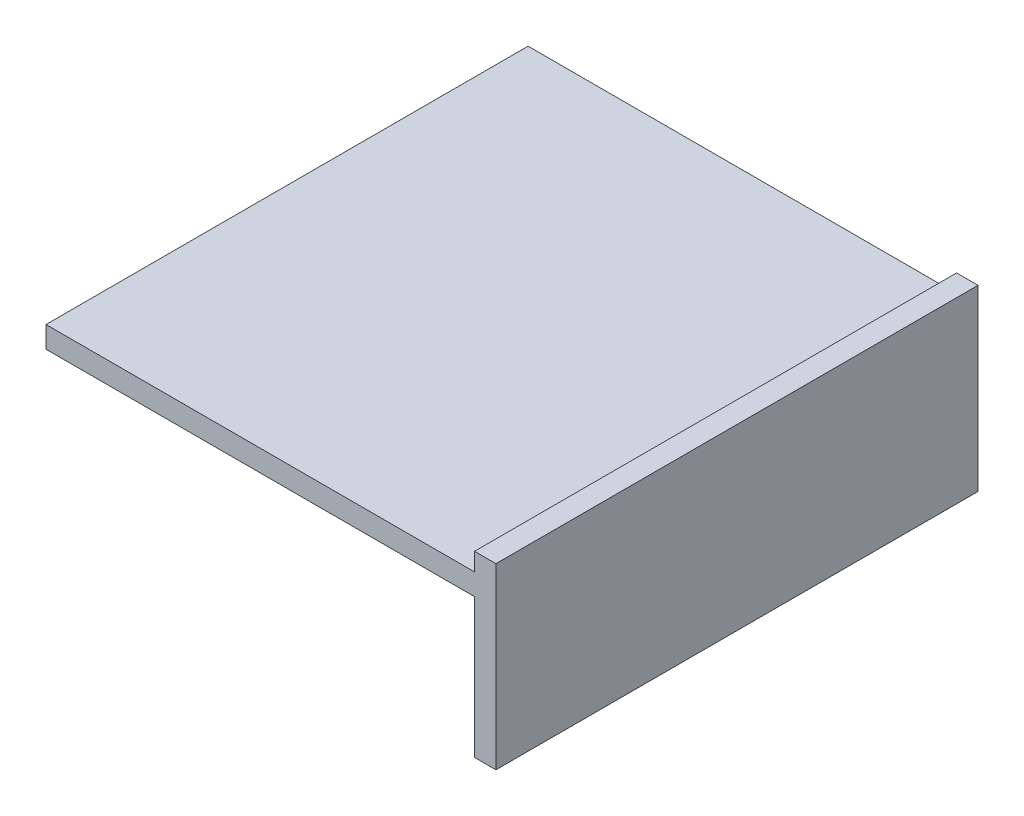
ISO-10303-21;
HEADER;
FILE_DESCRIPTION(('STEP AP214'),'2;1');
FILE_NAME('part.step','',(''),(''),'','','');
FILE_SCHEMA(('AUTOMOTIVE_DESIGN { 1 0 10303 214 1 1 1 1 }'));
ENDSEC;
DATA;
#1=APPLICATION_CONTEXT('core data for automotive mechanical design processes');
#2=APPLICATION_PROTOCOL_DEFINITION('international standard','automotive_design',2000,#1);
#3=PRODUCT_CONTEXT('',#1,'mechanical');
#4=PRODUCT('Part','Part','',(#3));
#5=PRODUCT_RELATED_PRODUCT_CATEGORY('part','',(#4));
#6=PRODUCT_DEFINITION_FORMATION('','',#4);
#7=PRODUCT_DEFINITION_CONTEXT('part definition',#1,'design');
#8=PRODUCT_DEFINITION('design','',#6,#7);
#9=PRODUCT_DEFINITION_SHAPE('','',#8);
#10=(LENGTH_UNIT() NAMED_UNIT(*) SI_UNIT(.MILLI.,.METRE.));
#11=(NAMED_UNIT(*) PLANE_ANGLE_UNIT() SI_UNIT($,.RADIAN.));
#12=(NAMED_UNIT(*) SI_UNIT($,.STERADIAN.) SOLID_ANGLE_UNIT());
#13=UNCERTAINTY_MEASURE_WITH_UNIT(LENGTH_MEASURE(1.E-05),#10,'distance_accuracy_value','');
#14=(GEOMETRIC_REPRESENTATION_CONTEXT(3) GLOBAL_UNCERTAINTY_ASSIGNED_CONTEXT((#13)) GLOBAL_UNIT_ASSIGNED_CONTEXT((#10,
#11,#12)) REPRESENTATION_CONTEXT('',''));
#15=CARTESIAN_POINT('',(0.,0.,0.));
#16=DIRECTION('',(0.,0.,1.));
#17=DIRECTION('',(1.,0.,0.));
#18=AXIS2_PLACEMENT_3D('',#15,#16,#17);
#19=CARTESIAN_POINT('',(0.,0.,0.));
#20=DIRECTION('',(0.,-1.,0.));
#21=DIRECTION('',(0.,0.,-1.));
#22=AXIS2_PLACEMENT_3D('',#19,#20,#21);
#23=PLANE('',#22);
#24=DIRECTION('',(0.,0.,1.));
#25=VECTOR('',#24,1.);
#26=CARTESIAN_POINT('',(0.,0.,0.));
#27=LINE('',#26,#25);
#28=CARTESIAN_POINT('',(0.,0.,-258.));
#29=VERTEX_POINT('',#28);
#30=CARTESIAN_POINT('',(0.,0.,0.));
#31=VERTEX_POINT('',#30);
#32=EDGE_CURVE('E72',#29,#31,#27,.T.);
#33=ORIENTED_EDGE('',*,*,#32,.F.);
#34=DIRECTION('',(1.,0.,0.));
#35=VECTOR('',#34,1.);
#36=CARTESIAN_POINT('',(0.,0.,-258.));
#37=LINE('',#36,#35);
#38=CARTESIAN_POINT('',(240.,0.,-258.));
#39=VERTEX_POINT('',#38);
#40=EDGE_CURVE('E140',#29,#39,#37,.T.);
#41=ORIENTED_EDGE('',*,*,#40,.T.);
#42=DIRECTION('',(0.,0.,-1.));
#43=VECTOR('',#42,1.);
#44=CARTESIAN_POINT('',(240.,0.,0.));
#45=LINE('',#44,#43);
#46=CARTESIAN_POINT('',(240.,0.,0.));
#47=VERTEX_POINT('',#46);
#48=EDGE_CURVE('E36',#47,#39,#45,.T.);
#49=ORIENTED_EDGE('',*,*,#48,.F.);
#50=DIRECTION('',(1.,0.,0.));
#51=VECTOR('',#50,1.);
#52=CARTESIAN_POINT('',(0.,0.,0.));
#53=LINE('',#52,#51);
#54=EDGE_CURVE('E181',#31,#47,#53,.T.);
#55=ORIENTED_EDGE('',*,*,#54,.F.);
#56=EDGE_LOOP('',(#33,#41,#49,#55));
#57=FACE_BOUND('',#56,.T.);
#58=ADVANCED_FACE('F32',(#57),#23,.T.);
#59=CARTESIAN_POINT('',(240.,0.,0.));
#60=DIRECTION('',(-1.,0.,0.));
#61=DIRECTION('',(0.,0.,1.));
#62=AXIS2_PLACEMENT_3D('',#59,#60,#61);
#63=PLANE('',#62);
#64=ORIENTED_EDGE('',*,*,#48,.T.);
#65=DIRECTION('',(0.,1.,0.));
#66=VECTOR('',#65,1.);
#67=CARTESIAN_POINT('',(240.,-78.,-258.));
#68=LINE('',#67,#66);
#69=CARTESIAN_POINT('',(240.,-78.,-258.));
#70=VERTEX_POINT('',#69);
#71=EDGE_CURVE('E138',#70,#39,#68,.T.);
#72=ORIENTED_EDGE('',*,*,#71,.F.);
#73=DIRECTION('',(0.,0.,-1.));
#74=VECTOR('',#73,1.);
#75=CARTESIAN_POINT('',(240.,-78.,-270.));
#76=LINE('',#75,#74);
#77=CARTESIAN_POINT('',(240.,-78.,0.));
#78=VERTEX_POINT('',#77);
#79=EDGE_CURVE('E150',#78,#70,#76,.T.);
#80=ORIENTED_EDGE('',*,*,#79,.F.);
#81=DIRECTION('',(0.,-1.,0.));
#82=VECTOR('',#81,1.);
#83=CARTESIAN_POINT('',(240.,22.,0.));
#84=LINE('',#83,#82);
#85=EDGE_CURVE('E82',#47,#78,#84,.T.);
#86=ORIENTED_EDGE('',*,*,#85,.F.);
#87=EDGE_LOOP('',(#64,#72,#80,#86));
#88=FACE_BOUND('',#87,.T.);
#89=ADVANCED_FACE('F199',(#88),#63,.T.);
#90=CARTESIAN_POINT('',(0.,12.,0.));
#91=DIRECTION('',(1.,0.,0.));
#92=DIRECTION('',(0.,0.,-1.));
#93=AXIS2_PLACEMENT_3D('',#90,#91,#92);
#94=PLANE('',#93);
#95=DIRECTION('',(0.,-1.,0.));
#96=VECTOR('',#95,1.);
#97=CARTESIAN_POINT('',(0.,12.,-270.));
#98=LINE('',#97,#96);
#99=CARTESIAN_POINT('',(0.,12.,-270.));
#100=VERTEX_POINT('',#99);
#101=CARTESIAN_POINT('',(0.,-78.,-270.));
#102=VERTEX_POINT('',#101);
#103=EDGE_CURVE('E42',#100,#102,#98,.T.);
#104=ORIENTED_EDGE('',*,*,#103,.T.);
#105=DIRECTION('',(0.,0.,1.));
#106=VECTOR('',#105,1.);
#107=CARTESIAN_POINT('',(0.,-78.,-270.));
#108=LINE('',#107,#106);
#109=CARTESIAN_POINT('',(0.,-78.,-258.));
#110=VERTEX_POINT('',#109);
#111=EDGE_CURVE('E119',#102,#110,#108,.T.);
#112=ORIENTED_EDGE('',*,*,#111,.T.);
#113=DIRECTION('',(0.,1.,0.));
#114=VECTOR('',#113,1.);
#115=CARTESIAN_POINT('',(0.,-78.,-258.));
#116=LINE('',#115,#114);
#117=EDGE_CURVE('E137',#110,#29,#116,.T.);
#118=ORIENTED_EDGE('',*,*,#117,.T.);
#119=ORIENTED_EDGE('',*,*,#32,.T.);
#120=DIRECTION('',(0.,-1.,0.));
#121=VECTOR('',#120,1.);
#122=CARTESIAN_POINT('',(0.,12.,0.));
#123=LINE('',#122,#121);
#124=CARTESIAN_POINT('',(0.,12.,0.));
#125=VERTEX_POINT('',#124);
#126=EDGE_CURVE('E11',#125,#31,#123,.T.);
#127=ORIENTED_EDGE('',*,*,#126,.F.);
#128=DIRECTION('',(0.,0.,1.));
#129=VECTOR('',#128,1.);
#130=CARTESIAN_POINT('',(0.,12.,0.));
#131=LINE('',#130,#129);
#132=EDGE_CURVE('E120',#100,#125,#131,.T.);
#133=ORIENTED_EDGE('',*,*,#132,.F.);
#134=EDGE_LOOP('',(#104,#112,#118,#119,#127,#133));
#135=FACE_BOUND('',#134,.T.);
#136=ADVANCED_FACE('F34',(#135),#94,.F.);
#137=CARTESIAN_POINT('',(0.,12.,0.));
#138=DIRECTION('',(0.,0.,-1.));
#139=DIRECTION('',(-1.,0.,0.));
#140=AXIS2_PLACEMENT_3D('',#137,#138,#139);
#141=PLANE('',#140);
#142=ORIENTED_EDGE('',*,*,#54,.T.);
#143=ORIENTED_EDGE('',*,*,#85,.T.);
#144=DIRECTION('',(-1.,0.,0.));
#145=VECTOR('',#144,1.);
#146=CARTESIAN_POINT('',(252.,-78.,0.));
#147=LINE('',#146,#145);
#148=CARTESIAN_POINT('',(252.,-78.,0.));
#149=VERTEX_POINT('',#148);
#150=EDGE_CURVE('E132',#149,#78,#147,.T.);
#151=ORIENTED_EDGE('',*,*,#150,.F.);
#152=DIRECTION('',(0.,-1.,0.));
#153=VECTOR('',#152,1.);
#154=CARTESIAN_POINT('',(252.,22.,0.));
#155=LINE('',#154,#153);
#156=CARTESIAN_POINT('',(252.,22.,0.));
#157=VERTEX_POINT('',#156);
#158=EDGE_CURVE('E152',#157,#149,#155,.T.);
#159=ORIENTED_EDGE('',*,*,#158,.F.);
#160=DIRECTION('',(-1.,0.,0.));
#161=VECTOR('',#160,1.);
#162=CARTESIAN_POINT('',(252.,22.,0.));
#163=LINE('',#162,#161);
#164=CARTESIAN_POINT('',(240.,22.,0.));
#165=VERTEX_POINT('',#164);
#166=EDGE_CURVE('E173',#157,#165,#163,.T.);
#167=ORIENTED_EDGE('',*,*,#166,.T.);
#168=CARTESIAN_POINT('',(240.,12.,0.));
#169=VERTEX_POINT('',#168);
#170=EDGE_CURVE('E164',#165,#169,#84,.T.);
#171=ORIENTED_EDGE('',*,*,#170,.T.);
#172=DIRECTION('',(1.,0.,0.));
#173=VECTOR('',#172,1.);
#174=CARTESIAN_POINT('',(0.,12.,0.));
#175=LINE('',#174,#173);
#176=EDGE_CURVE('E190',#125,#169,#175,.T.);
#177=ORIENTED_EDGE('',*,*,#176,.F.);
#178=ORIENTED_EDGE('',*,*,#126,.T.);
#179=EDGE_LOOP('',(#142,#143,#151,#159,#167,#171,#177,#178));
#180=FACE_BOUND('',#179,.T.);
#181=ADVANCED_FACE('F223',(#180),#141,.F.);
#182=CARTESIAN_POINT('',(0.,12.,-270.));
#183=DIRECTION('',(0.,0.,1.));
#184=DIRECTION('',(1.,0.,0.));
#185=AXIS2_PLACEMENT_3D('',#182,#183,#184);
#186=PLANE('',#185);
#187=DIRECTION('',(-1.,0.,0.));
#188=VECTOR('',#187,1.);
#189=CARTESIAN_POINT('',(252.,-78.,-270.));
#190=LINE('',#189,#188);
#191=CARTESIAN_POINT('',(252.,-78.,-270.));
#192=VERTEX_POINT('',#191);
#193=EDGE_CURVE('E125',#192,#102,#190,.T.);
#194=ORIENTED_EDGE('',*,*,#193,.T.);
#195=ORIENTED_EDGE('',*,*,#103,.F.);
#196=DIRECTION('',(-1.,0.,0.));
#197=VECTOR('',#196,1.);
#198=CARTESIAN_POINT('',(0.,12.,-270.));
#199=LINE('',#198,#197);
#200=CARTESIAN_POINT('',(240.,12.,-270.));
#201=VERTEX_POINT('',#200);
#202=EDGE_CURVE('E59',#201,#100,#199,.T.);
#203=ORIENTED_EDGE('',*,*,#202,.F.);
#204=DIRECTION('',(0.,1.,0.));
#205=VECTOR('',#204,1.);
#206=CARTESIAN_POINT('',(240.,22.,-270.));
#207=LINE('',#206,#205);
#208=CARTESIAN_POINT('',(240.,22.,-270.));
#209=VERTEX_POINT('',#208);
#210=EDGE_CURVE('E147',#201,#209,#207,.T.);
#211=ORIENTED_EDGE('',*,*,#210,.T.);
#212=DIRECTION('',(-1.,0.,0.));
#213=VECTOR('',#212,1.);
#214=CARTESIAN_POINT('',(252.,22.,-270.));
#215=LINE('',#214,#213);
#216=CARTESIAN_POINT('',(252.,22.,-270.));
#217=VERTEX_POINT('',#216);
#218=EDGE_CURVE('E162',#217,#209,#215,.T.);
#219=ORIENTED_EDGE('',*,*,#218,.F.);
#220=DIRECTION('',(0.,1.,0.));
#221=VECTOR('',#220,1.);
#222=CARTESIAN_POINT('',(252.,22.,-270.));
#223=LINE('',#222,#221);
#224=EDGE_CURVE('E129',#192,#217,#223,.T.);
#225=ORIENTED_EDGE('',*,*,#224,.F.);
#226=EDGE_LOOP('',(#194,#195,#203,#211,#219,#225));
#227=FACE_BOUND('',#226,.T.);
#228=ADVANCED_FACE('F126',(#227),#186,.F.);
#229=CARTESIAN_POINT('',(0.,12.,0.));
#230=DIRECTION('',(0.,-1.,0.));
#231=DIRECTION('',(0.,0.,-1.));
#232=AXIS2_PLACEMENT_3D('',#229,#230,#231);
#233=PLANE('',#232);
#234=ORIENTED_EDGE('',*,*,#132,.T.);
#235=ORIENTED_EDGE('',*,*,#176,.T.);
#236=DIRECTION('',(0.,0.,-1.));
#237=VECTOR('',#236,1.);
#238=CARTESIAN_POINT('',(240.,12.,0.));
#239=LINE('',#238,#237);
#240=EDGE_CURVE('E188',#169,#201,#239,.T.);
#241=ORIENTED_EDGE('',*,*,#240,.T.);
#242=ORIENTED_EDGE('',*,*,#202,.T.);
#243=EDGE_LOOP('',(#234,#235,#241,#242));
#244=FACE_BOUND('',#243,.T.);
#245=ADVANCED_FACE('F220',(#244),#233,.F.);
#246=ORIENTED_EDGE('',*,*,#240,.F.);
#247=ORIENTED_EDGE('',*,*,#170,.F.);
#248=DIRECTION('',(0.,0.,1.));
#249=VECTOR('',#248,1.);
#250=CARTESIAN_POINT('',(240.,22.,-270.));
#251=LINE('',#250,#249);
#252=EDGE_CURVE('E157',#209,#165,#251,.T.);
#253=ORIENTED_EDGE('',*,*,#252,.F.);
#254=ORIENTED_EDGE('',*,*,#210,.F.);
#255=EDGE_LOOP('',(#246,#247,#253,#254));
#256=FACE_BOUND('',#255,.T.);
#257=ADVANCED_FACE('F217',(#256),#63,.T.);
#258=CARTESIAN_POINT('',(252.,22.,-270.));
#259=DIRECTION('',(0.,-1.,0.));
#260=DIRECTION('',(0.,0.,-1.));
#261=AXIS2_PLACEMENT_3D('',#258,#259,#260);
#262=PLANE('',#261);
#263=ORIENTED_EDGE('',*,*,#252,.T.);
#264=ORIENTED_EDGE('',*,*,#166,.F.);
#265=DIRECTION('',(0.,0.,1.));
#266=VECTOR('',#265,1.);
#267=CARTESIAN_POINT('',(252.,22.,-270.));
#268=LINE('',#267,#266);
#269=EDGE_CURVE('E149',#217,#157,#268,.T.);
#270=ORIENTED_EDGE('',*,*,#269,.F.);
#271=ORIENTED_EDGE('',*,*,#218,.T.);
#272=EDGE_LOOP('',(#263,#264,#270,#271));
#273=FACE_BOUND('',#272,.T.);
#274=ADVANCED_FACE('F235',(#273),#262,.F.);
#275=CARTESIAN_POINT('',(252.,-78.,-270.));
#276=DIRECTION('',(0.,1.,0.));
#277=DIRECTION('',(0.,0.,1.));
#278=AXIS2_PLACEMENT_3D('',#275,#276,#277);
#279=PLANE('',#278);
#280=ORIENTED_EDGE('',*,*,#79,.T.);
#281=DIRECTION('',(1.,0.,0.));
#282=VECTOR('',#281,1.);
#283=CARTESIAN_POINT('',(0.,-78.,-258.));
#284=LINE('',#283,#282);
#285=EDGE_CURVE('E50',#110,#70,#284,.T.);
#286=ORIENTED_EDGE('',*,*,#285,.F.);
#287=ORIENTED_EDGE('',*,*,#111,.F.);
#288=ORIENTED_EDGE('',*,*,#193,.F.);
#289=DIRECTION('',(0.,0.,-1.));
#290=VECTOR('',#289,1.);
#291=CARTESIAN_POINT('',(252.,-78.,-270.));
#292=LINE('',#291,#290);
#293=EDGE_CURVE('E133',#149,#192,#292,.T.);
#294=ORIENTED_EDGE('',*,*,#293,.F.);
#295=ORIENTED_EDGE('',*,*,#150,.T.);
#296=EDGE_LOOP('',(#280,#286,#287,#288,#294,#295));
#297=FACE_BOUND('',#296,.T.);
#298=ADVANCED_FACE('F136',(#297),#279,.F.);
#299=CARTESIAN_POINT('',(252.,0.,0.));
#300=DIRECTION('',(-1.,0.,0.));
#301=DIRECTION('',(0.,0.,1.));
#302=AXIS2_PLACEMENT_3D('',#299,#300,#301);
#303=PLANE('',#302);
#304=ORIENTED_EDGE('',*,*,#224,.T.);
#305=ORIENTED_EDGE('',*,*,#269,.T.);
#306=ORIENTED_EDGE('',*,*,#158,.T.);
#307=ORIENTED_EDGE('',*,*,#293,.T.);
#308=EDGE_LOOP('',(#304,#305,#306,#307));
#309=FACE_BOUND('',#308,.T.);
#310=ADVANCED_FACE('F204',(#309),#303,.F.);
#311=CARTESIAN_POINT('',(0.,-78.,-258.));
#312=DIRECTION('',(0.,0.,-1.));
#313=DIRECTION('',(-1.,0.,0.));
#314=AXIS2_PLACEMENT_3D('',#311,#312,#313);
#315=PLANE('',#314);
#316=ORIENTED_EDGE('',*,*,#71,.T.);
#317=ORIENTED_EDGE('',*,*,#40,.F.);
#318=ORIENTED_EDGE('',*,*,#117,.F.);
#319=ORIENTED_EDGE('',*,*,#285,.T.);
#320=EDGE_LOOP('',(#316,#317,#318,#319));
#321=FACE_BOUND('',#320,.T.);
#322=ADVANCED_FACE('F202',(#321),#315,.F.);
#323=CLOSED_SHELL('',(#58,#89,#136,#181,#228,#245,#257,#274,#298,#310,#322));
#324=MANIFOLD_SOLID_BREP('B2',#323);
#325=ADVANCED_BREP_SHAPE_REPRESENTATION('',(#18,#324),#14);
#326=SHAPE_DEFINITION_REPRESENTATION(#9,#325);
ENDSEC;
END-ISO-10303-21;
